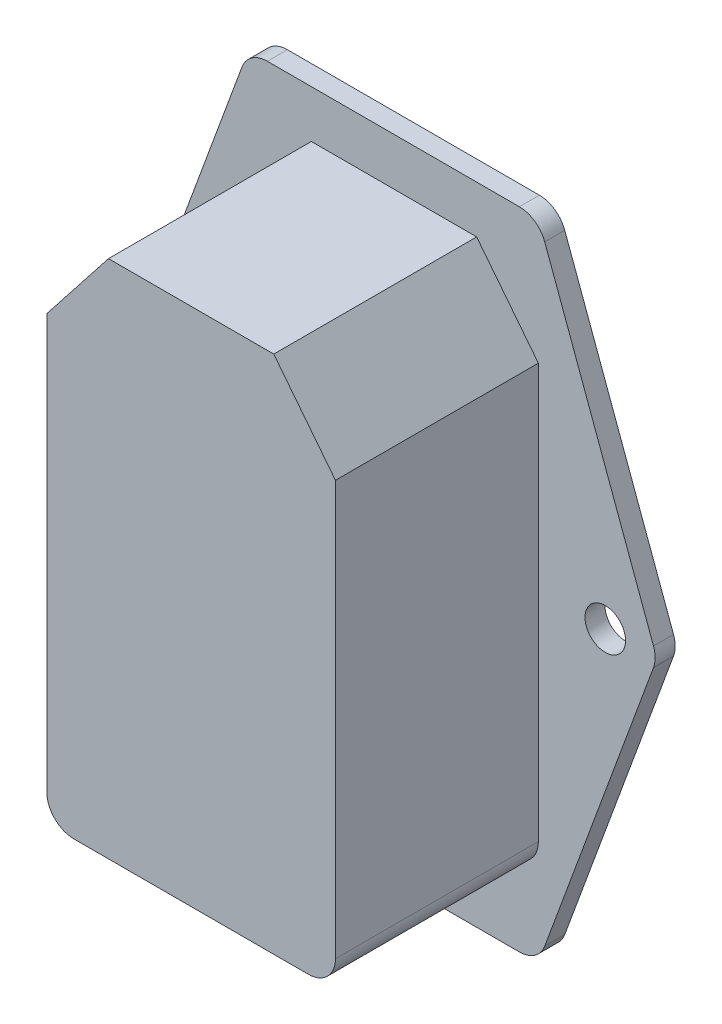
ISO-10303-21;
HEADER;
FILE_DESCRIPTION(('STEP AP214'),'2;1');
FILE_NAME('part.step','',(''),(''),'','','');
FILE_SCHEMA(('AUTOMOTIVE_DESIGN { 1 0 10303 214 1 1 1 1 }'));
ENDSEC;
DATA;
#1=APPLICATION_CONTEXT('core data for automotive mechanical design processes');
#2=APPLICATION_PROTOCOL_DEFINITION('international standard','automotive_design',2000,#1);
#3=PRODUCT_CONTEXT('',#1,'mechanical');
#4=PRODUCT('Part','Part','',(#3));
#5=PRODUCT_RELATED_PRODUCT_CATEGORY('part','',(#4));
#6=PRODUCT_DEFINITION_FORMATION('','',#4);
#7=PRODUCT_DEFINITION_CONTEXT('part definition',#1,'design');
#8=PRODUCT_DEFINITION('design','',#6,#7);
#9=PRODUCT_DEFINITION_SHAPE('','',#8);
#10=(LENGTH_UNIT() NAMED_UNIT(*) SI_UNIT(.MILLI.,.METRE.));
#11=(NAMED_UNIT(*) PLANE_ANGLE_UNIT() SI_UNIT($,.RADIAN.));
#12=(NAMED_UNIT(*) SI_UNIT($,.STERADIAN.) SOLID_ANGLE_UNIT());
#13=UNCERTAINTY_MEASURE_WITH_UNIT(LENGTH_MEASURE(1.E-05),#10,'distance_accuracy_value','');
#14=(GEOMETRIC_REPRESENTATION_CONTEXT(3) GLOBAL_UNCERTAINTY_ASSIGNED_CONTEXT((#13)) GLOBAL_UNIT_ASSIGNED_CONTEXT((#10,
#11,#12)) REPRESENTATION_CONTEXT('',''));
#15=CARTESIAN_POINT('',(0.,0.,0.));
#16=DIRECTION('',(0.,0.,1.));
#17=DIRECTION('',(1.,0.,0.));
#18=AXIS2_PLACEMENT_3D('',#15,#16,#17);
#19=CARTESIAN_POINT('',(2.54,2.54,19.0500000000001));
#20=DIRECTION('',(0.,0.,-1.));
#21=DIRECTION('',(-1.,0.,0.));
#22=AXIS2_PLACEMENT_3D('',#19,#20,#21);
#23=CYLINDRICAL_SURFACE('',#22,2.54);
#24=CARTESIAN_POINT('',(2.54,2.54,0.));
#25=DIRECTION('',(0.,0.,1.));
#26=DIRECTION('',(-1.,0.,0.));
#27=AXIS2_PLACEMENT_3D('',#24,#25,#26);
#28=CIRCLE('',#27,2.54);
#29=CARTESIAN_POINT('',(0.,2.54000000000002,0.));
#30=VERTEX_POINT('',#29);
#31=CARTESIAN_POINT('',(2.54000000000002,0.,0.));
#32=VERTEX_POINT('',#31);
#33=EDGE_CURVE('E259',#30,#32,#28,.T.);
#34=ORIENTED_EDGE('',*,*,#33,.T.);
#35=DIRECTION('',(0.,0.,-1.));
#36=VECTOR('',#35,1.);
#37=CARTESIAN_POINT('',(2.54000000000002,0.,19.0500000000001));
#38=LINE('',#37,#36);
#39=CARTESIAN_POINT('',(2.54000000000002,0.,19.0500000000001));
#40=VERTEX_POINT('',#39);
#41=EDGE_CURVE('E11',#40,#32,#38,.T.);
#42=ORIENTED_EDGE('',*,*,#41,.F.);
#43=CARTESIAN_POINT('',(2.54,2.54,19.0500000000001));
#44=DIRECTION('',(0.,0.,1.));
#45=DIRECTION('',(-1.,0.,0.));
#46=AXIS2_PLACEMENT_3D('',#43,#44,#45);
#47=CIRCLE('',#46,2.54);
#48=CARTESIAN_POINT('',(0.,2.54000000000002,19.0500000000001));
#49=VERTEX_POINT('',#48);
#50=EDGE_CURVE('E279',#49,#40,#47,.T.);
#51=ORIENTED_EDGE('',*,*,#50,.F.);
#52=DIRECTION('',(0.,0.,-1.));
#53=VECTOR('',#52,1.);
#54=CARTESIAN_POINT('',(0.,2.54000000000002,19.0500000000001));
#55=LINE('',#54,#53);
#56=EDGE_CURVE('E295',#49,#30,#55,.T.);
#57=ORIENTED_EDGE('',*,*,#56,.T.);
#58=EDGE_LOOP('',(#34,#42,#51,#57));
#59=FACE_BOUND('',#58,.T.);
#60=ADVANCED_FACE('F34',(#59),#23,.T.);
#61=CARTESIAN_POINT('',(2.54000000000002,0.,19.0500000000001));
#62=DIRECTION('',(0.,1.,0.));
#63=DIRECTION('',(0.,0.,1.));
#64=AXIS2_PLACEMENT_3D('',#61,#62,#63);
#65=PLANE('',#64);
#66=DIRECTION('',(1.,0.,0.));
#67=VECTOR('',#66,1.);
#68=CARTESIAN_POINT('',(2.54000000000002,0.,0.));
#69=LINE('',#68,#67);
#70=CARTESIAN_POINT('',(24.5618,0.,0.));
#71=VERTEX_POINT('',#70);
#72=EDGE_CURVE('E298',#32,#71,#69,.T.);
#73=ORIENTED_EDGE('',*,*,#72,.T.);
#74=DIRECTION('',(0.,0.,-1.));
#75=VECTOR('',#74,1.);
#76=CARTESIAN_POINT('',(24.5618,0.,19.0500000000001));
#77=LINE('',#76,#75);
#78=CARTESIAN_POINT('',(24.5618,0.,19.0500000000001));
#79=VERTEX_POINT('',#78);
#80=EDGE_CURVE('E43',#79,#71,#77,.T.);
#81=ORIENTED_EDGE('',*,*,#80,.F.);
#82=DIRECTION('',(1.,0.,0.));
#83=VECTOR('',#82,1.);
#84=CARTESIAN_POINT('',(2.54000000000002,0.,19.0500000000001));
#85=LINE('',#84,#83);
#86=EDGE_CURVE('E281',#40,#79,#85,.T.);
#87=ORIENTED_EDGE('',*,*,#86,.F.);
#88=ORIENTED_EDGE('',*,*,#41,.T.);
#89=EDGE_LOOP('',(#73,#81,#87,#88));
#90=FACE_BOUND('',#89,.T.);
#91=ADVANCED_FACE('F362',(#90),#65,.F.);
#92=CARTESIAN_POINT('',(24.5618,2.54,19.0500000000001));
#93=DIRECTION('',(0.,0.,-1.));
#94=DIRECTION('',(-1.,0.,0.));
#95=AXIS2_PLACEMENT_3D('',#92,#93,#94);
#96=CYLINDRICAL_SURFACE('',#95,2.54);
#97=CARTESIAN_POINT('',(24.5618,2.54,0.));
#98=DIRECTION('',(0.,0.,1.));
#99=DIRECTION('',(1.,0.,0.));
#100=AXIS2_PLACEMENT_3D('',#97,#98,#99);
#101=CIRCLE('',#100,2.54);
#102=CARTESIAN_POINT('',(27.1018,2.54,0.));
#103=VERTEX_POINT('',#102);
#104=EDGE_CURVE('E301',#71,#103,#101,.T.);
#105=ORIENTED_EDGE('',*,*,#104,.T.);
#106=DIRECTION('',(0.,0.,-1.));
#107=VECTOR('',#106,1.);
#108=CARTESIAN_POINT('',(27.1018,2.54,19.0500000000001));
#109=LINE('',#108,#107);
#110=CARTESIAN_POINT('',(27.1018,2.54,19.0500000000001));
#111=VERTEX_POINT('',#110);
#112=EDGE_CURVE('E332',#111,#103,#109,.T.);
#113=ORIENTED_EDGE('',*,*,#112,.F.);
#114=CARTESIAN_POINT('',(24.5618,2.54,19.0500000000001));
#115=DIRECTION('',(0.,0.,1.));
#116=DIRECTION('',(1.,0.,0.));
#117=AXIS2_PLACEMENT_3D('',#114,#115,#116);
#118=CIRCLE('',#117,2.54);
#119=EDGE_CURVE('E284',#79,#111,#118,.T.);
#120=ORIENTED_EDGE('',*,*,#119,.F.);
#121=ORIENTED_EDGE('',*,*,#80,.T.);
#122=EDGE_LOOP('',(#105,#113,#120,#121));
#123=FACE_BOUND('',#122,.T.);
#124=ADVANCED_FACE('F367',(#123),#96,.T.);
#125=CARTESIAN_POINT('',(27.1018,2.54000000000002,19.0500000000001));
#126=DIRECTION('',(-1.,0.,0.));
#127=DIRECTION('',(0.,0.,1.));
#128=AXIS2_PLACEMENT_3D('',#125,#126,#127);
#129=PLANE('',#128);
#130=DIRECTION('',(0.,1.,0.));
#131=VECTOR('',#130,1.);
#132=CARTESIAN_POINT('',(27.1018,2.54000000000002,0.));
#133=LINE('',#132,#131);
#134=CARTESIAN_POINT('',(27.1018,41.4401,0.));
#135=VERTEX_POINT('',#134);
#136=EDGE_CURVE('E304',#103,#135,#133,.T.);
#137=ORIENTED_EDGE('',*,*,#136,.T.);
#138=DIRECTION('',(0.,0.,-1.));
#139=VECTOR('',#138,1.);
#140=CARTESIAN_POINT('',(27.1018,41.4401,19.0500000000001));
#141=LINE('',#140,#139);
#142=CARTESIAN_POINT('',(27.1018,41.4401,19.0500000000001));
#143=VERTEX_POINT('',#142);
#144=EDGE_CURVE('E329',#143,#135,#141,.T.);
#145=ORIENTED_EDGE('',*,*,#144,.F.);
#146=DIRECTION('',(0.,1.,0.));
#147=VECTOR('',#146,1.);
#148=CARTESIAN_POINT('',(27.1018,2.54000000000002,19.0500000000001));
#149=LINE('',#148,#147);
#150=EDGE_CURVE('E286',#111,#143,#149,.T.);
#151=ORIENTED_EDGE('',*,*,#150,.F.);
#152=ORIENTED_EDGE('',*,*,#112,.T.);
#153=EDGE_LOOP('',(#137,#145,#151,#152));
#154=FACE_BOUND('',#153,.T.);
#155=ADVANCED_FACE('F390',(#154),#129,.F.);
#156=CARTESIAN_POINT('',(27.1018,41.4401,19.0500000000001));
#157=DIRECTION('',(-0.786267556224711,-0.617886178861787,0.));
#158=DIRECTION('',(0.617886178861787,-0.786267556224711,0.));
#159=AXIS2_PLACEMENT_3D('',#156,#157,#158);
#160=PLANE('',#159);
#161=DIRECTION('',(-0.617886178861787,0.786267556224711,0.));
#162=VECTOR('',#161,1.);
#163=CARTESIAN_POINT('',(27.1018,41.4401,0.));
#164=LINE('',#163,#162);
#165=CARTESIAN_POINT('',(21.3106,48.8094712974717,0.));
#166=VERTEX_POINT('',#165);
#167=EDGE_CURVE('E307',#135,#166,#164,.T.);
#168=ORIENTED_EDGE('',*,*,#167,.T.);
#169=DIRECTION('',(0.,0.,-1.));
#170=VECTOR('',#169,1.);
#171=CARTESIAN_POINT('',(21.3106,48.8094712974717,19.0500000000001));
#172=LINE('',#171,#170);
#173=CARTESIAN_POINT('',(21.3106,48.8094712974717,19.0500000000001));
#174=VERTEX_POINT('',#173);
#175=EDGE_CURVE('E326',#174,#166,#172,.T.);
#176=ORIENTED_EDGE('',*,*,#175,.F.);
#177=DIRECTION('',(-0.617886178861787,0.786267556224711,0.));
#178=VECTOR('',#177,1.);
#179=CARTESIAN_POINT('',(27.1018,41.4401,19.0500000000001));
#180=LINE('',#179,#178);
#181=EDGE_CURVE('E288',#143,#174,#180,.T.);
#182=ORIENTED_EDGE('',*,*,#181,.F.);
#183=ORIENTED_EDGE('',*,*,#144,.T.);
#184=EDGE_LOOP('',(#168,#176,#182,#183));
#185=FACE_BOUND('',#184,.T.);
#186=ADVANCED_FACE('F387',(#185),#160,.F.);
#187=CARTESIAN_POINT('',(21.3106,48.8094712974717,19.0500000000001));
#188=DIRECTION('',(0.,-1.,0.));
#189=DIRECTION('',(0.,0.,-1.));
#190=AXIS2_PLACEMENT_3D('',#187,#188,#189);
#191=PLANE('',#190);
#192=DIRECTION('',(-1.,0.,0.));
#193=VECTOR('',#192,1.);
#194=CARTESIAN_POINT('',(21.3106,48.8094712974717,0.));
#195=LINE('',#194,#193);
#196=CARTESIAN_POINT('',(5.79120000000001,48.8094712974717,0.));
#197=VERTEX_POINT('',#196);
#198=EDGE_CURVE('E310',#166,#197,#195,.T.);
#199=ORIENTED_EDGE('',*,*,#198,.T.);
#200=DIRECTION('',(0.,0.,-1.));
#201=VECTOR('',#200,1.);
#202=CARTESIAN_POINT('',(5.79120000000001,48.8094712974717,19.0500000000001));
#203=LINE('',#202,#201);
#204=CARTESIAN_POINT('',(5.79120000000001,48.8094712974717,19.0500000000001));
#205=VERTEX_POINT('',#204);
#206=EDGE_CURVE('E323',#205,#197,#203,.T.);
#207=ORIENTED_EDGE('',*,*,#206,.F.);
#208=DIRECTION('',(-1.,0.,0.));
#209=VECTOR('',#208,1.);
#210=CARTESIAN_POINT('',(21.3106,48.8094712974717,19.0500000000001));
#211=LINE('',#210,#209);
#212=EDGE_CURVE('E290',#174,#205,#211,.T.);
#213=ORIENTED_EDGE('',*,*,#212,.F.);
#214=ORIENTED_EDGE('',*,*,#175,.T.);
#215=EDGE_LOOP('',(#199,#207,#213,#214));
#216=FACE_BOUND('',#215,.T.);
#217=ADVANCED_FACE('F382',(#216),#191,.F.);
#218=CARTESIAN_POINT('',(0.,41.4401,19.0500000000001));
#219=DIRECTION('',(0.78626755622471,-0.617886178861789,0.));
#220=DIRECTION('',(0.617886178861789,0.78626755622471,0.));
#221=AXIS2_PLACEMENT_3D('',#218,#219,#220);
#222=PLANE('',#221);
#223=DIRECTION('',(-0.617886178861789,-0.78626755622471,0.));
#224=VECTOR('',#223,1.);
#225=CARTESIAN_POINT('',(0.,41.4401,0.));
#226=LINE('',#225,#224);
#227=CARTESIAN_POINT('',(0.,41.4401,0.));
#228=VERTEX_POINT('',#227);
#229=EDGE_CURVE('E313',#197,#228,#226,.T.);
#230=ORIENTED_EDGE('',*,*,#229,.T.);
#231=DIRECTION('',(0.,0.,-1.));
#232=VECTOR('',#231,1.);
#233=CARTESIAN_POINT('',(0.,41.4401,19.0500000000001));
#234=LINE('',#233,#232);
#235=CARTESIAN_POINT('',(0.,41.4401,19.0500000000001));
#236=VERTEX_POINT('',#235);
#237=EDGE_CURVE('E320',#236,#228,#234,.T.);
#238=ORIENTED_EDGE('',*,*,#237,.F.);
#239=DIRECTION('',(-0.617886178861789,-0.78626755622471,0.));
#240=VECTOR('',#239,1.);
#241=CARTESIAN_POINT('',(0.,41.4401,19.0500000000001));
#242=LINE('',#241,#240);
#243=EDGE_CURVE('E292',#205,#236,#242,.T.);
#244=ORIENTED_EDGE('',*,*,#243,.F.);
#245=ORIENTED_EDGE('',*,*,#206,.T.);
#246=EDGE_LOOP('',(#230,#238,#244,#245));
#247=FACE_BOUND('',#246,.T.);
#248=ADVANCED_FACE('F379',(#247),#222,.F.);
#249=CARTESIAN_POINT('',(0.,2.54000000000002,19.0500000000001));
#250=DIRECTION('',(1.,0.,0.));
#251=DIRECTION('',(0.,0.,-1.));
#252=AXIS2_PLACEMENT_3D('',#249,#250,#251);
#253=PLANE('',#252);
#254=DIRECTION('',(0.,-1.,0.));
#255=VECTOR('',#254,1.);
#256=CARTESIAN_POINT('',(0.,2.54000000000002,0.));
#257=LINE('',#256,#255);
#258=EDGE_CURVE('E282',#228,#30,#257,.T.);
#259=ORIENTED_EDGE('',*,*,#258,.T.);
#260=ORIENTED_EDGE('',*,*,#56,.F.);
#261=DIRECTION('',(0.,-1.,0.));
#262=VECTOR('',#261,1.);
#263=CARTESIAN_POINT('',(0.,2.54000000000002,19.0500000000001));
#264=LINE('',#263,#262);
#265=EDGE_CURVE('E51',#236,#49,#264,.T.);
#266=ORIENTED_EDGE('',*,*,#265,.F.);
#267=ORIENTED_EDGE('',*,*,#237,.T.);
#268=EDGE_LOOP('',(#259,#260,#266,#267));
#269=FACE_BOUND('',#268,.T.);
#270=ADVANCED_FACE('F375',(#269),#253,.F.);
#271=CARTESIAN_POINT('',(2.54,2.54,19.0500000000001));
#272=DIRECTION('',(0.,0.,-1.));
#273=DIRECTION('',(-1.,0.,0.));
#274=AXIS2_PLACEMENT_3D('',#271,#272,#273);
#275=PLANE('',#274);
#276=ORIENTED_EDGE('',*,*,#50,.T.);
#277=ORIENTED_EDGE('',*,*,#86,.T.);
#278=ORIENTED_EDGE('',*,*,#119,.T.);
#279=ORIENTED_EDGE('',*,*,#150,.T.);
#280=ORIENTED_EDGE('',*,*,#181,.T.);
#281=ORIENTED_EDGE('',*,*,#212,.T.);
#282=ORIENTED_EDGE('',*,*,#243,.T.);
#283=ORIENTED_EDGE('',*,*,#265,.T.);
#284=EDGE_LOOP('',(#276,#277,#278,#279,#280,#281,#282,#283));
#285=FACE_BOUND('',#284,.T.);
#286=ADVANCED_FACE('F396',(#285),#275,.F.);
#287=CARTESIAN_POINT('',(1.6575819845485,-4.7879,-1.8796));
#288=DIRECTION('',(0.,0.,1.));
#289=DIRECTION('',(1.,0.,0.));
#290=AXIS2_PLACEMENT_3D('',#287,#288,#289);
#291=CYLINDRICAL_SURFACE('',#290,2.54);
#292=CARTESIAN_POINT('',(1.6575819845485,-4.7879,0.));
#293=DIRECTION('',(0.,0.,1.));
#294=DIRECTION('',(-1.,0.,0.));
#295=AXIS2_PLACEMENT_3D('',#292,#293,#294);
#296=CIRCLE('',#295,2.54);
#297=CARTESIAN_POINT('',(-0.726168664542624,-5.66501620835419,0.));
#298=VERTEX_POINT('',#297);
#299=CARTESIAN_POINT('',(1.65758198454852,-7.3279,0.));
#300=VERTEX_POINT('',#299);
#301=EDGE_CURVE('E229',#298,#300,#296,.T.);
#302=ORIENTED_EDGE('',*,*,#301,.F.);
#303=DIRECTION('',(0.,0.,1.));
#304=VECTOR('',#303,1.);
#305=CARTESIAN_POINT('',(-0.726168664542624,-5.66501620835419,-1.8796));
#306=LINE('',#305,#304);
#307=CARTESIAN_POINT('',(-0.726168664542624,-5.66501620835419,-1.8796));
#308=VERTEX_POINT('',#307);
#309=EDGE_CURVE('E193',#308,#298,#306,.T.);
#310=ORIENTED_EDGE('',*,*,#309,.F.);
#311=CARTESIAN_POINT('',(1.6575819845485,-4.7879,-1.8796));
#312=DIRECTION('',(0.,0.,1.));
#313=DIRECTION('',(-1.,0.,0.));
#314=AXIS2_PLACEMENT_3D('',#311,#312,#313);
#315=CIRCLE('',#314,2.54);
#316=CARTESIAN_POINT('',(1.65758198454852,-7.3279,-1.8796));
#317=VERTEX_POINT('',#316);
#318=EDGE_CURVE('E186',#308,#317,#315,.T.);
#319=ORIENTED_EDGE('',*,*,#318,.T.);
#320=DIRECTION('',(0.,0.,1.));
#321=VECTOR('',#320,1.);
#322=CARTESIAN_POINT('',(1.65758198454852,-7.3279,-1.8796));
#323=LINE('',#322,#321);
#324=EDGE_CURVE('E168',#317,#300,#323,.T.);
#325=ORIENTED_EDGE('',*,*,#324,.T.);
#326=EDGE_LOOP('',(#302,#310,#319,#325));
#327=FACE_BOUND('',#326,.T.);
#328=ADVANCED_FACE('F192',(#327),#291,.T.);
#329=CARTESIAN_POINT('',(-0.726168664542624,-5.66501620835419,-1.8796));
#330=DIRECTION('',(-0.93848450751619,-0.345321341871732,0.));
#331=DIRECTION('',(0.345321341871732,-0.938484507516191,0.));
#332=AXIS2_PLACEMENT_3D('',#329,#330,#331);
#333=PLANE('',#332);
#334=DIRECTION('',(0.345321341871732,-0.93848450751619,0.));
#335=VECTOR('',#334,1.);
#336=CARTESIAN_POINT('',(-0.726168664542624,-5.66501620835419,0.));
#337=LINE('',#336,#335);
#338=CARTESIAN_POINT('',(-10.9397304021172,22.0925194403817,0.));
#339=VERTEX_POINT('',#338);
#340=EDGE_CURVE('E194',#339,#298,#337,.T.);
#341=ORIENTED_EDGE('',*,*,#340,.F.);
#342=DIRECTION('',(0.,0.,1.));
#343=VECTOR('',#342,1.);
#344=CARTESIAN_POINT('',(-10.9397304021172,22.0925194403817,-1.8796));
#345=LINE('',#344,#343);
#346=CARTESIAN_POINT('',(-10.9397304021172,22.0925194403817,-1.8796));
#347=VERTEX_POINT('',#346);
#348=EDGE_CURVE('E260',#347,#339,#345,.T.);
#349=ORIENTED_EDGE('',*,*,#348,.F.);
#350=DIRECTION('',(0.345321341871732,-0.93848450751619,0.));
#351=VECTOR('',#350,1.);
#352=CARTESIAN_POINT('',(-0.726168664542624,-5.66501620835419,-1.8796));
#353=LINE('',#352,#351);
#354=EDGE_CURVE('E179',#347,#308,#353,.T.);
#355=ORIENTED_EDGE('',*,*,#354,.T.);
#356=ORIENTED_EDGE('',*,*,#309,.T.);
#357=EDGE_LOOP('',(#341,#349,#355,#356));
#358=FACE_BOUND('',#357,.T.);
#359=ADVANCED_FACE('F403',(#358),#333,.T.);
#360=CARTESIAN_POINT('',(-8.55597975302609,22.9696356487359,-1.8796));
#361=DIRECTION('',(0.,0.,1.));
#362=DIRECTION('',(1.,0.,0.));
#363=AXIS2_PLACEMENT_3D('',#360,#361,#362);
#364=CYLINDRICAL_SURFACE('',#363,2.54);
#365=CARTESIAN_POINT('',(-8.55597975302609,22.9696356487359,0.));
#366=DIRECTION('',(0.,0.,1.));
#367=DIRECTION('',(-1.,0.,0.));
#368=AXIS2_PLACEMENT_3D('',#365,#366,#367);
#369=CIRCLE('',#368,2.54);
#370=CARTESIAN_POINT('',(-10.9397304021172,23.8467518570901,0.));
#371=VERTEX_POINT('',#370);
#372=EDGE_CURVE('E197',#371,#339,#369,.T.);
#373=ORIENTED_EDGE('',*,*,#372,.F.);
#374=DIRECTION('',(0.,0.,1.));
#375=VECTOR('',#374,1.);
#376=CARTESIAN_POINT('',(-10.9397304021172,23.8467518570901,-1.8796));
#377=LINE('',#376,#375);
#378=CARTESIAN_POINT('',(-10.9397304021172,23.8467518570901,-1.8796));
#379=VERTEX_POINT('',#378);
#380=EDGE_CURVE('E262',#379,#371,#377,.T.);
#381=ORIENTED_EDGE('',*,*,#380,.F.);
#382=CARTESIAN_POINT('',(-8.55597975302609,22.9696356487359,-1.8796));
#383=DIRECTION('',(0.,0.,1.));
#384=DIRECTION('',(-1.,0.,0.));
#385=AXIS2_PLACEMENT_3D('',#382,#383,#384);
#386=CIRCLE('',#385,2.54);
#387=EDGE_CURVE('E225',#379,#347,#386,.T.);
#388=ORIENTED_EDGE('',*,*,#387,.T.);
#389=ORIENTED_EDGE('',*,*,#348,.T.);
#390=EDGE_LOOP('',(#373,#381,#388,#389));
#391=FACE_BOUND('',#390,.T.);
#392=ADVANCED_FACE('F457',(#391),#364,.T.);
#393=CARTESIAN_POINT('',(-10.9397304021172,23.8467518570901,-1.8796));
#394=DIRECTION('',(-0.938484507516191,0.345321341871732,0.));
#395=DIRECTION('',(-0.345321341871732,-0.938484507516191,0.));
#396=AXIS2_PLACEMENT_3D('',#393,#394,#395);
#397=PLANE('',#396);
#398=DIRECTION('',(-0.345321341871732,-0.938484507516191,0.));
#399=VECTOR('',#398,1.);
#400=CARTESIAN_POINT('',(-10.9397304021172,23.8467518570901,0.));
#401=LINE('',#400,#399);
#402=CARTESIAN_POINT('',(-0.726168664542624,51.6042875058259,0.));
#403=VERTEX_POINT('',#402);
#404=EDGE_CURVE('E253',#403,#371,#401,.T.);
#405=ORIENTED_EDGE('',*,*,#404,.F.);
#406=DIRECTION('',(0.,0.,1.));
#407=VECTOR('',#406,1.);
#408=CARTESIAN_POINT('',(-0.726168664542624,51.6042875058259,-1.8796));
#409=LINE('',#408,#407);
#410=CARTESIAN_POINT('',(-0.726168664542624,51.6042875058259,-1.8796));
#411=VERTEX_POINT('',#410);
#412=EDGE_CURVE('E264',#411,#403,#409,.T.);
#413=ORIENTED_EDGE('',*,*,#412,.F.);
#414=DIRECTION('',(-0.345321341871732,-0.938484507516191,0.));
#415=VECTOR('',#414,1.);
#416=CARTESIAN_POINT('',(-10.9397304021172,23.8467518570901,-1.8796));
#417=LINE('',#416,#415);
#418=EDGE_CURVE('E222',#411,#379,#417,.T.);
#419=ORIENTED_EDGE('',*,*,#418,.T.);
#420=ORIENTED_EDGE('',*,*,#380,.T.);
#421=EDGE_LOOP('',(#405,#413,#419,#420));
#422=FACE_BOUND('',#421,.T.);
#423=ADVANCED_FACE('F467',(#422),#397,.T.);
#424=CARTESIAN_POINT('',(1.6575819845485,50.7271712974717,-1.8796));
#425=DIRECTION('',(0.,0.,1.));
#426=DIRECTION('',(1.,0.,0.));
#427=AXIS2_PLACEMENT_3D('',#424,#425,#426);
#428=CYLINDRICAL_SURFACE('',#427,2.54);
#429=CARTESIAN_POINT('',(1.6575819845485,50.7271712974717,0.));
#430=DIRECTION('',(0.,0.,1.));
#431=DIRECTION('',(-1.,0.,0.));
#432=AXIS2_PLACEMENT_3D('',#429,#430,#431);
#433=CIRCLE('',#432,2.54);
#434=CARTESIAN_POINT('',(1.65758198454852,53.2671712974717,0.));
#435=VERTEX_POINT('',#434);
#436=EDGE_CURVE('E250',#435,#403,#433,.T.);
#437=ORIENTED_EDGE('',*,*,#436,.F.);
#438=DIRECTION('',(0.,0.,1.));
#439=VECTOR('',#438,1.);
#440=CARTESIAN_POINT('',(1.65758198454852,53.2671712974717,-1.8796));
#441=LINE('',#440,#439);
#442=CARTESIAN_POINT('',(1.65758198454852,53.2671712974717,-1.8796));
#443=VERTEX_POINT('',#442);
#444=EDGE_CURVE('E266',#443,#435,#441,.T.);
#445=ORIENTED_EDGE('',*,*,#444,.F.);
#446=CARTESIAN_POINT('',(1.6575819845485,50.7271712974717,-1.8796));
#447=DIRECTION('',(0.,0.,1.));
#448=DIRECTION('',(-1.,0.,0.));
#449=AXIS2_PLACEMENT_3D('',#446,#447,#448);
#450=CIRCLE('',#449,2.54);
#451=EDGE_CURVE('E219',#443,#411,#450,.T.);
#452=ORIENTED_EDGE('',*,*,#451,.T.);
#453=ORIENTED_EDGE('',*,*,#412,.T.);
#454=EDGE_LOOP('',(#437,#445,#452,#453));
#455=FACE_BOUND('',#454,.T.);
#456=ADVANCED_FACE('F477',(#455),#428,.T.);
#457=CARTESIAN_POINT('',(1.65758198454852,53.2671712974717,-1.8796));
#458=DIRECTION('',(0.,1.,0.));
#459=DIRECTION('',(0.,0.,1.));
#460=AXIS2_PLACEMENT_3D('',#457,#458,#459);
#461=PLANE('',#460);
#462=DIRECTION('',(-1.,0.,0.));
#463=VECTOR('',#462,1.);
#464=CARTESIAN_POINT('',(1.65758198454852,53.2671712974717,0.));
#465=LINE('',#464,#463);
#466=CARTESIAN_POINT('',(25.3172180154515,53.2671712974717,0.));
#467=VERTEX_POINT('',#466);
#468=EDGE_CURVE('E247',#467,#435,#465,.T.);
#469=ORIENTED_EDGE('',*,*,#468,.F.);
#470=DIRECTION('',(0.,0.,1.));
#471=VECTOR('',#470,1.);
#472=CARTESIAN_POINT('',(25.3172180154515,53.2671712974717,-1.8796));
#473=LINE('',#472,#471);
#474=CARTESIAN_POINT('',(25.3172180154515,53.2671712974717,-1.8796));
#475=VERTEX_POINT('',#474);
#476=EDGE_CURVE('E268',#475,#467,#473,.T.);
#477=ORIENTED_EDGE('',*,*,#476,.F.);
#478=DIRECTION('',(-1.,0.,0.));
#479=VECTOR('',#478,1.);
#480=CARTESIAN_POINT('',(1.65758198454852,53.2671712974717,-1.8796));
#481=LINE('',#480,#479);
#482=EDGE_CURVE('E216',#475,#443,#481,.T.);
#483=ORIENTED_EDGE('',*,*,#482,.T.);
#484=ORIENTED_EDGE('',*,*,#444,.T.);
#485=EDGE_LOOP('',(#469,#477,#483,#484));
#486=FACE_BOUND('',#485,.T.);
#487=ADVANCED_FACE('F487',(#486),#461,.T.);
#488=CARTESIAN_POINT('',(25.3172180154515,50.7271712974717,-1.8796));
#489=DIRECTION('',(0.,0.,1.));
#490=DIRECTION('',(1.,0.,0.));
#491=AXIS2_PLACEMENT_3D('',#488,#489,#490);
#492=CYLINDRICAL_SURFACE('',#491,2.54);
#493=CARTESIAN_POINT('',(25.3172180154515,50.7271712974717,0.));
#494=DIRECTION('',(0.,0.,1.));
#495=DIRECTION('',(1.,0.,0.));
#496=AXIS2_PLACEMENT_3D('',#493,#494,#495);
#497=CIRCLE('',#496,2.54);
#498=CARTESIAN_POINT('',(27.7009686645426,51.6042875058259,0.));
#499=VERTEX_POINT('',#498);
#500=EDGE_CURVE('E244',#499,#467,#497,.T.);
#501=ORIENTED_EDGE('',*,*,#500,.F.);
#502=DIRECTION('',(0.,0.,1.));
#503=VECTOR('',#502,1.);
#504=CARTESIAN_POINT('',(27.7009686645426,51.6042875058259,-1.8796));
#505=LINE('',#504,#503);
#506=CARTESIAN_POINT('',(27.7009686645426,51.6042875058259,-1.8796));
#507=VERTEX_POINT('',#506);
#508=EDGE_CURVE('E270',#507,#499,#505,.T.);
#509=ORIENTED_EDGE('',*,*,#508,.F.);
#510=CARTESIAN_POINT('',(25.3172180154515,50.7271712974717,-1.8796));
#511=DIRECTION('',(0.,0.,1.));
#512=DIRECTION('',(1.,0.,0.));
#513=AXIS2_PLACEMENT_3D('',#510,#511,#512);
#514=CIRCLE('',#513,2.54);
#515=EDGE_CURVE('E213',#507,#475,#514,.T.);
#516=ORIENTED_EDGE('',*,*,#515,.T.);
#517=ORIENTED_EDGE('',*,*,#476,.T.);
#518=EDGE_LOOP('',(#501,#509,#516,#517));
#519=FACE_BOUND('',#518,.T.);
#520=ADVANCED_FACE('F497',(#519),#492,.T.);
#521=CARTESIAN_POINT('',(27.7009686645426,51.6042875058259,-1.8796));
#522=DIRECTION('',(0.938484507516191,0.345321341871732,0.));
#523=DIRECTION('',(-0.345321341871732,0.938484507516191,0.));
#524=AXIS2_PLACEMENT_3D('',#521,#522,#523);
#525=PLANE('',#524);
#526=DIRECTION('',(-0.345321341871732,0.938484507516191,0.));
#527=VECTOR('',#526,1.);
#528=CARTESIAN_POINT('',(27.7009686645426,51.6042875058259,0.));
#529=LINE('',#528,#527);
#530=CARTESIAN_POINT('',(37.9145304021172,23.8467518570901,0.));
#531=VERTEX_POINT('',#530);
#532=EDGE_CURVE('E241',#531,#499,#529,.T.);
#533=ORIENTED_EDGE('',*,*,#532,.F.);
#534=DIRECTION('',(0.,0.,1.));
#535=VECTOR('',#534,1.);
#536=CARTESIAN_POINT('',(37.9145304021172,23.8467518570901,-1.8796));
#537=LINE('',#536,#535);
#538=CARTESIAN_POINT('',(37.9145304021172,23.8467518570901,-1.8796));
#539=VERTEX_POINT('',#538);
#540=EDGE_CURVE('E272',#539,#531,#537,.T.);
#541=ORIENTED_EDGE('',*,*,#540,.F.);
#542=DIRECTION('',(-0.345321341871732,0.938484507516191,0.));
#543=VECTOR('',#542,1.);
#544=CARTESIAN_POINT('',(27.7009686645426,51.6042875058259,-1.8796));
#545=LINE('',#544,#543);
#546=EDGE_CURVE('E210',#539,#507,#545,.T.);
#547=ORIENTED_EDGE('',*,*,#546,.T.);
#548=ORIENTED_EDGE('',*,*,#508,.T.);
#549=EDGE_LOOP('',(#533,#541,#547,#548));
#550=FACE_BOUND('',#549,.T.);
#551=ADVANCED_FACE('F507',(#550),#525,.T.);
#552=CARTESIAN_POINT('',(35.5307797530261,22.9696356487359,-1.8796));
#553=DIRECTION('',(0.,0.,1.));
#554=DIRECTION('',(1.,0.,0.));
#555=AXIS2_PLACEMENT_3D('',#552,#553,#554);
#556=CYLINDRICAL_SURFACE('',#555,2.54);
#557=CARTESIAN_POINT('',(35.5307797530261,22.9696356487359,0.));
#558=DIRECTION('',(0.,0.,1.));
#559=DIRECTION('',(1.,0.,0.));
#560=AXIS2_PLACEMENT_3D('',#557,#558,#559);
#561=CIRCLE('',#560,2.54);
#562=CARTESIAN_POINT('',(37.9145304021172,22.0925194403817,0.));
#563=VERTEX_POINT('',#562);
#564=EDGE_CURVE('E238',#563,#531,#561,.T.);
#565=ORIENTED_EDGE('',*,*,#564,.F.);
#566=DIRECTION('',(0.,0.,1.));
#567=VECTOR('',#566,1.);
#568=CARTESIAN_POINT('',(37.9145304021172,22.0925194403817,-1.8796));
#569=LINE('',#568,#567);
#570=CARTESIAN_POINT('',(37.9145304021172,22.0925194403817,-1.8796));
#571=VERTEX_POINT('',#570);
#572=EDGE_CURVE('E274',#571,#563,#569,.T.);
#573=ORIENTED_EDGE('',*,*,#572,.F.);
#574=CARTESIAN_POINT('',(35.5307797530261,22.9696356487359,-1.8796));
#575=DIRECTION('',(0.,0.,1.));
#576=DIRECTION('',(1.,0.,0.));
#577=AXIS2_PLACEMENT_3D('',#574,#575,#576);
#578=CIRCLE('',#577,2.54);
#579=EDGE_CURVE('E207',#571,#539,#578,.T.);
#580=ORIENTED_EDGE('',*,*,#579,.T.);
#581=ORIENTED_EDGE('',*,*,#540,.T.);
#582=EDGE_LOOP('',(#565,#573,#580,#581));
#583=FACE_BOUND('',#582,.T.);
#584=ADVANCED_FACE('F517',(#583),#556,.T.);
#585=CARTESIAN_POINT('',(37.9145304021172,22.0925194403817,-1.8796));
#586=DIRECTION('',(0.938484507516191,-0.345321341871732,0.));
#587=DIRECTION('',(0.345321341871732,0.938484507516191,0.));
#588=AXIS2_PLACEMENT_3D('',#585,#586,#587);
#589=PLANE('',#588);
#590=DIRECTION('',(0.345321341871732,0.93848450751619,0.));
#591=VECTOR('',#590,1.);
#592=CARTESIAN_POINT('',(37.9145304021172,22.0925194403817,0.));
#593=LINE('',#592,#591);
#594=CARTESIAN_POINT('',(27.7009686645426,-5.66501620835419,0.));
#595=VERTEX_POINT('',#594);
#596=EDGE_CURVE('E235',#595,#563,#593,.T.);
#597=ORIENTED_EDGE('',*,*,#596,.F.);
#598=DIRECTION('',(0.,0.,1.));
#599=VECTOR('',#598,1.);
#600=CARTESIAN_POINT('',(27.7009686645426,-5.66501620835419,-1.8796));
#601=LINE('',#600,#599);
#602=CARTESIAN_POINT('',(27.7009686645426,-5.66501620835419,-1.8796));
#603=VERTEX_POINT('',#602);
#604=EDGE_CURVE('E276',#603,#595,#601,.T.);
#605=ORIENTED_EDGE('',*,*,#604,.F.);
#606=DIRECTION('',(0.345321341871732,0.93848450751619,0.));
#607=VECTOR('',#606,1.);
#608=CARTESIAN_POINT('',(37.9145304021172,22.0925194403817,-1.8796));
#609=LINE('',#608,#607);
#610=EDGE_CURVE('E204',#603,#571,#609,.T.);
#611=ORIENTED_EDGE('',*,*,#610,.T.);
#612=ORIENTED_EDGE('',*,*,#572,.T.);
#613=EDGE_LOOP('',(#597,#605,#611,#612));
#614=FACE_BOUND('',#613,.T.);
#615=ADVANCED_FACE('F527',(#614),#589,.T.);
#616=CARTESIAN_POINT('',(25.3172180154515,-4.7879,-1.8796));
#617=DIRECTION('',(0.,0.,1.));
#618=DIRECTION('',(1.,0.,0.));
#619=AXIS2_PLACEMENT_3D('',#616,#617,#618);
#620=CYLINDRICAL_SURFACE('',#619,2.54);
#621=CARTESIAN_POINT('',(25.3172180154515,-4.7879,0.));
#622=DIRECTION('',(0.,0.,1.));
#623=DIRECTION('',(-1.,0.,0.));
#624=AXIS2_PLACEMENT_3D('',#621,#622,#623);
#625=CIRCLE('',#624,2.54);
#626=CARTESIAN_POINT('',(25.3172180154515,-7.3279,0.));
#627=VERTEX_POINT('',#626);
#628=EDGE_CURVE('E232',#627,#595,#625,.T.);
#629=ORIENTED_EDGE('',*,*,#628,.F.);
#630=DIRECTION('',(0.,0.,1.));
#631=VECTOR('',#630,1.);
#632=CARTESIAN_POINT('',(25.3172180154515,-7.3279,-1.8796));
#633=LINE('',#632,#631);
#634=CARTESIAN_POINT('',(25.3172180154515,-7.3279,-1.8796));
#635=VERTEX_POINT('',#634);
#636=EDGE_CURVE('E178',#635,#627,#633,.T.);
#637=ORIENTED_EDGE('',*,*,#636,.F.);
#638=CARTESIAN_POINT('',(25.3172180154515,-4.7879,-1.8796));
#639=DIRECTION('',(0.,0.,1.));
#640=DIRECTION('',(-1.,0.,0.));
#641=AXIS2_PLACEMENT_3D('',#638,#639,#640);
#642=CIRCLE('',#641,2.54);
#643=EDGE_CURVE('E190',#635,#603,#642,.T.);
#644=ORIENTED_EDGE('',*,*,#643,.T.);
#645=ORIENTED_EDGE('',*,*,#604,.T.);
#646=EDGE_LOOP('',(#629,#637,#644,#645));
#647=FACE_BOUND('',#646,.T.);
#648=ADVANCED_FACE('F537',(#647),#620,.T.);
#649=CARTESIAN_POINT('',(25.3172180154515,-7.3279,-1.8796));
#650=DIRECTION('',(0.,-1.,0.));
#651=DIRECTION('',(1.,0.,0.));
#652=AXIS2_PLACEMENT_3D('',#649,#650,#651);
#653=PLANE('',#652);
#654=DIRECTION('',(1.,0.,0.));
#655=VECTOR('',#654,1.);
#656=CARTESIAN_POINT('',(25.3172180154515,-7.3279,0.));
#657=LINE('',#656,#655);
#658=EDGE_CURVE('E173',#300,#627,#657,.T.);
#659=ORIENTED_EDGE('',*,*,#658,.F.);
#660=ORIENTED_EDGE('',*,*,#324,.F.);
#661=DIRECTION('',(1.,0.,0.));
#662=VECTOR('',#661,1.);
#663=CARTESIAN_POINT('',(25.3172180154515,-7.3279,-1.8796));
#664=LINE('',#663,#662);
#665=EDGE_CURVE('E171',#317,#635,#664,.T.);
#666=ORIENTED_EDGE('',*,*,#665,.T.);
#667=ORIENTED_EDGE('',*,*,#636,.T.);
#668=EDGE_LOOP('',(#659,#660,#666,#667));
#669=FACE_BOUND('',#668,.T.);
#670=ADVANCED_FACE('F170',(#669),#653,.T.);
#671=CARTESIAN_POINT('',(1.6575819845485,-4.7879,-1.8796));
#672=DIRECTION('',(0.,0.,-1.));
#673=DIRECTION('',(-1.,0.,0.));
#674=AXIS2_PLACEMENT_3D('',#671,#672,#673);
#675=PLANE('',#674);
#676=CARTESIAN_POINT('',(33.3844797530261,22.9696356487359,-1.8796));
#677=DIRECTION('',(0.,0.,-1.));
#678=DIRECTION('',(-1.,0.,0.));
#679=AXIS2_PLACEMENT_3D('',#676,#677,#678);
#680=CIRCLE('',#679,1.905);
#681=CARTESIAN_POINT('',(31.4794797530261,22.9696356487359,-1.8796));
#682=VERTEX_POINT('',#681);
#683=EDGE_CURVE('E200',#682,#682,#680,.F.);
#684=ORIENTED_EDGE('',*,*,#683,.T.);
#685=EDGE_LOOP('',(#684));
#686=FACE_BOUND('',#685,.T.);
#687=CARTESIAN_POINT('',(-6.40967975302609,22.9696356487359,-1.8796));
#688=DIRECTION('',(0.,0.,-1.));
#689=DIRECTION('',(-1.,0.,0.));
#690=AXIS2_PLACEMENT_3D('',#687,#688,#689);
#691=CIRCLE('',#690,1.905);
#692=CARTESIAN_POINT('',(-8.31467975302609,22.9696356487359,-1.8796));
#693=VERTEX_POINT('',#692);
#694=EDGE_CURVE('E338',#693,#693,#691,.F.);
#695=ORIENTED_EDGE('',*,*,#694,.T.);
#696=EDGE_LOOP('',(#695));
#697=FACE_BOUND('',#696,.T.);
#698=ORIENTED_EDGE('',*,*,#318,.F.);
#699=ORIENTED_EDGE('',*,*,#354,.F.);
#700=ORIENTED_EDGE('',*,*,#387,.F.);
#701=ORIENTED_EDGE('',*,*,#418,.F.);
#702=ORIENTED_EDGE('',*,*,#451,.F.);
#703=ORIENTED_EDGE('',*,*,#482,.F.);
#704=ORIENTED_EDGE('',*,*,#515,.F.);
#705=ORIENTED_EDGE('',*,*,#546,.F.);
#706=ORIENTED_EDGE('',*,*,#579,.F.);
#707=ORIENTED_EDGE('',*,*,#610,.F.);
#708=ORIENTED_EDGE('',*,*,#643,.F.);
#709=ORIENTED_EDGE('',*,*,#665,.F.);
#710=EDGE_LOOP('',(#698,#699,#700,#701,#702,#703,#704,#705,#706,#707,#708,#709));
#711=FACE_BOUND('',#710,.T.);
#712=ADVANCED_FACE('F184',(#686,#697,#711),#675,.T.);
#713=CARTESIAN_POINT('',(1.6575819845485,-4.7879,0.));
#714=DIRECTION('',(0.,0.,-1.));
#715=DIRECTION('',(-1.,0.,0.));
#716=AXIS2_PLACEMENT_3D('',#713,#714,#715);
#717=PLANE('',#716);
#718=CARTESIAN_POINT('',(33.3844797530261,22.9696356487359,0.));
#719=DIRECTION('',(0.,0.,-1.));
#720=DIRECTION('',(-1.,0.,0.));
#721=AXIS2_PLACEMENT_3D('',#718,#719,#720);
#722=CIRCLE('',#721,1.905);
#723=CARTESIAN_POINT('',(31.4794797530261,22.9696356487359,0.));
#724=VERTEX_POINT('',#723);
#725=EDGE_CURVE('E37',#724,#724,#722,.F.);
#726=ORIENTED_EDGE('',*,*,#725,.F.);
#727=EDGE_LOOP('',(#726));
#728=FACE_BOUND('',#727,.T.);
#729=CARTESIAN_POINT('',(-6.40967975302609,22.9696356487359,0.));
#730=DIRECTION('',(0.,0.,-1.));
#731=DIRECTION('',(-1.,0.,0.));
#732=AXIS2_PLACEMENT_3D('',#729,#730,#731);
#733=CIRCLE('',#732,1.905);
#734=CARTESIAN_POINT('',(-8.31467975302609,22.9696356487359,0.));
#735=VERTEX_POINT('',#734);
#736=EDGE_CURVE('E336',#735,#735,#733,.F.);
#737=ORIENTED_EDGE('',*,*,#736,.F.);
#738=EDGE_LOOP('',(#737));
#739=FACE_BOUND('',#738,.T.);
#740=ORIENTED_EDGE('',*,*,#33,.F.);
#741=ORIENTED_EDGE('',*,*,#258,.F.);
#742=ORIENTED_EDGE('',*,*,#229,.F.);
#743=ORIENTED_EDGE('',*,*,#198,.F.);
#744=ORIENTED_EDGE('',*,*,#167,.F.);
#745=ORIENTED_EDGE('',*,*,#136,.F.);
#746=ORIENTED_EDGE('',*,*,#104,.F.);
#747=ORIENTED_EDGE('',*,*,#72,.F.);
#748=EDGE_LOOP('',(#740,#741,#742,#743,#744,#745,#746,#747));
#749=FACE_BOUND('',#748,.T.);
#750=ORIENTED_EDGE('',*,*,#301,.T.);
#751=ORIENTED_EDGE('',*,*,#658,.T.);
#752=ORIENTED_EDGE('',*,*,#628,.T.);
#753=ORIENTED_EDGE('',*,*,#596,.T.);
#754=ORIENTED_EDGE('',*,*,#564,.T.);
#755=ORIENTED_EDGE('',*,*,#532,.T.);
#756=ORIENTED_EDGE('',*,*,#500,.T.);
#757=ORIENTED_EDGE('',*,*,#468,.T.);
#758=ORIENTED_EDGE('',*,*,#436,.T.);
#759=ORIENTED_EDGE('',*,*,#404,.T.);
#760=ORIENTED_EDGE('',*,*,#372,.T.);
#761=ORIENTED_EDGE('',*,*,#340,.T.);
#762=EDGE_LOOP('',(#750,#751,#752,#753,#754,#755,#756,#757,#758,#759,#760,#761));
#763=FACE_BOUND('',#762,.T.);
#764=ADVANCED_FACE('F358',(#728,#739,#749,#763),#717,.F.);
#765=CARTESIAN_POINT('',(-6.40967975302609,22.9696356487359,22.606));
#766=DIRECTION('',(0.,0.,-1.));
#767=DIRECTION('',(-1.,0.,0.));
#768=AXIS2_PLACEMENT_3D('',#765,#766,#767);
#769=CYLINDRICAL_SURFACE('',#768,1.905);
#770=ORIENTED_EDGE('',*,*,#694,.F.);
#771=EDGE_LOOP('',(#770));
#772=FACE_BOUND('',#771,.T.);
#773=ORIENTED_EDGE('',*,*,#736,.T.);
#774=EDGE_LOOP('',(#773));
#775=FACE_BOUND('',#774,.T.);
#776=ADVANCED_FACE('F353',(#772,#775),#769,.F.);
#777=CARTESIAN_POINT('',(33.3844797530261,22.9696356487359,22.606));
#778=DIRECTION('',(0.,0.,-1.));
#779=DIRECTION('',(-1.,0.,0.));
#780=AXIS2_PLACEMENT_3D('',#777,#778,#779);
#781=CYLINDRICAL_SURFACE('',#780,1.905);
#782=ORIENTED_EDGE('',*,*,#683,.F.);
#783=EDGE_LOOP('',(#782));
#784=FACE_BOUND('',#783,.T.);
#785=ORIENTED_EDGE('',*,*,#725,.T.);
#786=EDGE_LOOP('',(#785));
#787=FACE_BOUND('',#786,.T.);
#788=ADVANCED_FACE('F351',(#784,#787),#781,.F.);
#789=CLOSED_SHELL('',(#60,#91,#124,#155,#186,#217,#248,#270,#286,#328,#359,#392,#423,#456,#487,
#520,#551,#584,#615,#648,#670,#712,#764,#776,#788));
#790=MANIFOLD_SOLID_BREP('B2',#789);
#791=ADVANCED_BREP_SHAPE_REPRESENTATION('',(#18,#790),#14);
#792=SHAPE_DEFINITION_REPRESENTATION(#9,#791);
ENDSEC;
END-ISO-10303-21;
